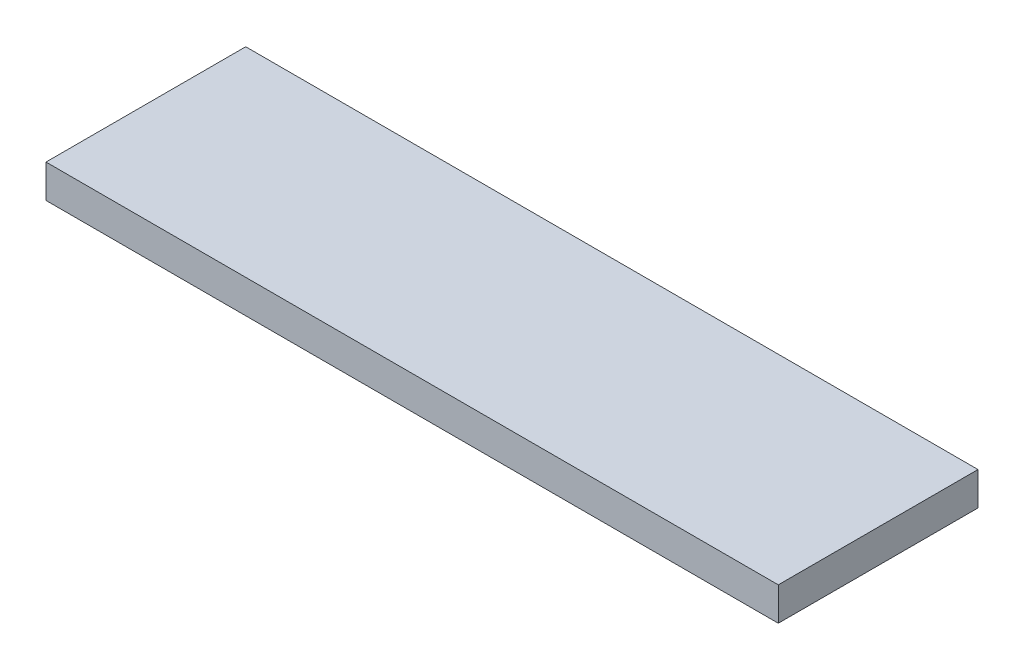
ISO-10303-21;
HEADER;
FILE_DESCRIPTION(('STEP AP214'),'2;1');
FILE_NAME('part.step','',(''),(''),'','','');
FILE_SCHEMA(('AUTOMOTIVE_DESIGN { 1 0 10303 214 1 1 1 1 }'));
ENDSEC;
DATA;
#1=APPLICATION_CONTEXT('core data for automotive mechanical design processes');
#2=APPLICATION_PROTOCOL_DEFINITION('international standard','automotive_design',2000,#1);
#3=PRODUCT_CONTEXT('',#1,'mechanical');
#4=PRODUCT('Part','Part','',(#3));
#5=PRODUCT_RELATED_PRODUCT_CATEGORY('part','',(#4));
#6=PRODUCT_DEFINITION_FORMATION('','',#4);
#7=PRODUCT_DEFINITION_CONTEXT('part definition',#1,'design');
#8=PRODUCT_DEFINITION('design','',#6,#7);
#9=PRODUCT_DEFINITION_SHAPE('','',#8);
#10=(LENGTH_UNIT() NAMED_UNIT(*) SI_UNIT(.MILLI.,.METRE.));
#11=(NAMED_UNIT(*) PLANE_ANGLE_UNIT() SI_UNIT($,.RADIAN.));
#12=(NAMED_UNIT(*) SI_UNIT($,.STERADIAN.) SOLID_ANGLE_UNIT());
#13=UNCERTAINTY_MEASURE_WITH_UNIT(LENGTH_MEASURE(1.E-05),#10,'distance_accuracy_value','');
#14=(GEOMETRIC_REPRESENTATION_CONTEXT(3) GLOBAL_UNCERTAINTY_ASSIGNED_CONTEXT((#13)) GLOBAL_UNIT_ASSIGNED_CONTEXT((#10,
#11,#12)) REPRESENTATION_CONTEXT('',''));
#15=CARTESIAN_POINT('',(0.,0.,0.));
#16=DIRECTION('',(0.,0.,1.));
#17=DIRECTION('',(1.,0.,0.));
#18=AXIS2_PLACEMENT_3D('',#15,#16,#17);
#19=CARTESIAN_POINT('',(550.,50.,150.));
#20=DIRECTION('',(-1.,0.,0.));
#21=DIRECTION('',(0.,0.,1.));
#22=AXIS2_PLACEMENT_3D('',#19,#20,#21);
#23=PLANE('',#22);
#24=DIRECTION('',(0.,0.,-1.));
#25=VECTOR('',#24,1.);
#26=CARTESIAN_POINT('',(550.,0.,150.));
#27=LINE('',#26,#25);
#28=CARTESIAN_POINT('',(550.,0.,150.));
#29=VERTEX_POINT('',#28);
#30=CARTESIAN_POINT('',(550.,0.,-150.));
#31=VERTEX_POINT('',#30);
#32=EDGE_CURVE('E96',#29,#31,#27,.T.);
#33=ORIENTED_EDGE('',*,*,#32,.T.);
#34=DIRECTION('',(0.,-1.,0.));
#35=VECTOR('',#34,1.);
#36=CARTESIAN_POINT('',(550.,50.,-150.));
#37=LINE('',#36,#35);
#38=CARTESIAN_POINT('',(550.,50.,-150.));
#39=VERTEX_POINT('',#38);
#40=EDGE_CURVE('E11',#39,#31,#37,.T.);
#41=ORIENTED_EDGE('',*,*,#40,.F.);
#42=DIRECTION('',(0.,0.,-1.));
#43=VECTOR('',#42,1.);
#44=CARTESIAN_POINT('',(550.,50.,150.));
#45=LINE('',#44,#43);
#46=CARTESIAN_POINT('',(550.,50.,150.));
#47=VERTEX_POINT('',#46);
#48=EDGE_CURVE('E84',#47,#39,#45,.T.);
#49=ORIENTED_EDGE('',*,*,#48,.F.);
#50=DIRECTION('',(0.,-1.,0.));
#51=VECTOR('',#50,1.);
#52=CARTESIAN_POINT('',(550.,50.,150.));
#53=LINE('',#52,#51);
#54=EDGE_CURVE('E92',#47,#29,#53,.T.);
#55=ORIENTED_EDGE('',*,*,#54,.T.);
#56=EDGE_LOOP('',(#33,#41,#49,#55));
#57=FACE_BOUND('',#56,.T.);
#58=ADVANCED_FACE('F33',(#57),#23,.F.);
#59=CARTESIAN_POINT('',(-550.,50.,-150.));
#60=DIRECTION('',(0.,0.,1.));
#61=DIRECTION('',(1.,0.,0.));
#62=AXIS2_PLACEMENT_3D('',#59,#60,#61);
#63=PLANE('',#62);
#64=DIRECTION('',(-1.,0.,0.));
#65=VECTOR('',#64,1.);
#66=CARTESIAN_POINT('',(-550.,0.,-150.));
#67=LINE('',#66,#65);
#68=CARTESIAN_POINT('',(-550.,0.,-150.));
#69=VERTEX_POINT('',#68);
#70=EDGE_CURVE('E88',#31,#69,#67,.T.);
#71=ORIENTED_EDGE('',*,*,#70,.T.);
#72=DIRECTION('',(0.,-1.,0.));
#73=VECTOR('',#72,1.);
#74=CARTESIAN_POINT('',(-550.,50.,-150.));
#75=LINE('',#74,#73);
#76=CARTESIAN_POINT('',(-550.,50.,-150.));
#77=VERTEX_POINT('',#76);
#78=EDGE_CURVE('E41',#77,#69,#75,.T.);
#79=ORIENTED_EDGE('',*,*,#78,.F.);
#80=DIRECTION('',(-1.,0.,0.));
#81=VECTOR('',#80,1.);
#82=CARTESIAN_POINT('',(-550.,50.,-150.));
#83=LINE('',#82,#81);
#84=EDGE_CURVE('E79',#39,#77,#83,.T.);
#85=ORIENTED_EDGE('',*,*,#84,.F.);
#86=ORIENTED_EDGE('',*,*,#40,.T.);
#87=EDGE_LOOP('',(#71,#79,#85,#86));
#88=FACE_BOUND('',#87,.T.);
#89=ADVANCED_FACE('F87',(#88),#63,.F.);
#90=CARTESIAN_POINT('',(-550.,50.,150.));
#91=DIRECTION('',(1.,0.,0.));
#92=DIRECTION('',(0.,0.,-1.));
#93=AXIS2_PLACEMENT_3D('',#90,#91,#92);
#94=PLANE('',#93);
#95=DIRECTION('',(0.,0.,1.));
#96=VECTOR('',#95,1.);
#97=CARTESIAN_POINT('',(-550.,0.,150.));
#98=LINE('',#97,#96);
#99=CARTESIAN_POINT('',(-550.,0.,150.));
#100=VERTEX_POINT('',#99);
#101=EDGE_CURVE('E66',#69,#100,#98,.T.);
#102=ORIENTED_EDGE('',*,*,#101,.T.);
#103=DIRECTION('',(0.,-1.,0.));
#104=VECTOR('',#103,1.);
#105=CARTESIAN_POINT('',(-550.,50.,150.));
#106=LINE('',#105,#104);
#107=CARTESIAN_POINT('',(-550.,50.,150.));
#108=VERTEX_POINT('',#107);
#109=EDGE_CURVE('E89',#108,#100,#106,.T.);
#110=ORIENTED_EDGE('',*,*,#109,.F.);
#111=DIRECTION('',(0.,0.,1.));
#112=VECTOR('',#111,1.);
#113=CARTESIAN_POINT('',(-550.,50.,150.));
#114=LINE('',#113,#112);
#115=EDGE_CURVE('E82',#77,#108,#114,.T.);
#116=ORIENTED_EDGE('',*,*,#115,.F.);
#117=ORIENTED_EDGE('',*,*,#78,.T.);
#118=EDGE_LOOP('',(#102,#110,#116,#117));
#119=FACE_BOUND('',#118,.T.);
#120=ADVANCED_FACE('F90',(#119),#94,.F.);
#121=CARTESIAN_POINT('',(-550.,50.,150.));
#122=DIRECTION('',(0.,0.,-1.));
#123=DIRECTION('',(-1.,0.,0.));
#124=AXIS2_PLACEMENT_3D('',#121,#122,#123);
#125=PLANE('',#124);
#126=DIRECTION('',(1.,0.,0.));
#127=VECTOR('',#126,1.);
#128=CARTESIAN_POINT('',(-550.,0.,150.));
#129=LINE('',#128,#127);
#130=EDGE_CURVE('E72',#100,#29,#129,.T.);
#131=ORIENTED_EDGE('',*,*,#130,.T.);
#132=ORIENTED_EDGE('',*,*,#54,.F.);
#133=DIRECTION('',(1.,0.,0.));
#134=VECTOR('',#133,1.);
#135=CARTESIAN_POINT('',(-550.,50.,150.));
#136=LINE('',#135,#134);
#137=EDGE_CURVE('E49',#108,#47,#136,.T.);
#138=ORIENTED_EDGE('',*,*,#137,.F.);
#139=ORIENTED_EDGE('',*,*,#109,.T.);
#140=EDGE_LOOP('',(#131,#132,#138,#139));
#141=FACE_BOUND('',#140,.T.);
#142=ADVANCED_FACE('F103',(#141),#125,.F.);
#143=CARTESIAN_POINT('',(0.,50.,0.));
#144=DIRECTION('',(0.,-1.,0.));
#145=DIRECTION('',(0.,0.,-1.));
#146=AXIS2_PLACEMENT_3D('',#143,#144,#145);
#147=PLANE('',#146);
#148=ORIENTED_EDGE('',*,*,#48,.T.);
#149=ORIENTED_EDGE('',*,*,#84,.T.);
#150=ORIENTED_EDGE('',*,*,#115,.T.);
#151=ORIENTED_EDGE('',*,*,#137,.T.);
#152=EDGE_LOOP('',(#148,#149,#150,#151));
#153=FACE_BOUND('',#152,.T.);
#154=ADVANCED_FACE('F80',(#153),#147,.F.);
#155=CARTESIAN_POINT('',(0.,0.,0.));
#156=DIRECTION('',(0.,-1.,0.));
#157=DIRECTION('',(0.,0.,-1.));
#158=AXIS2_PLACEMENT_3D('',#155,#156,#157);
#159=PLANE('',#158);
#160=ORIENTED_EDGE('',*,*,#32,.F.);
#161=ORIENTED_EDGE('',*,*,#130,.F.);
#162=ORIENTED_EDGE('',*,*,#101,.F.);
#163=ORIENTED_EDGE('',*,*,#70,.F.);
#164=EDGE_LOOP('',(#160,#161,#162,#163));
#165=FACE_BOUND('',#164,.T.);
#166=ADVANCED_FACE('F106',(#165),#159,.T.);
#167=CLOSED_SHELL('',(#58,#89,#120,#142,#154,#166));
#168=MANIFOLD_SOLID_BREP('B2',#167);
#169=ADVANCED_BREP_SHAPE_REPRESENTATION('',(#18,#168),#14);
#170=SHAPE_DEFINITION_REPRESENTATION(#9,#169);
ENDSEC;
END-ISO-10303-21;
